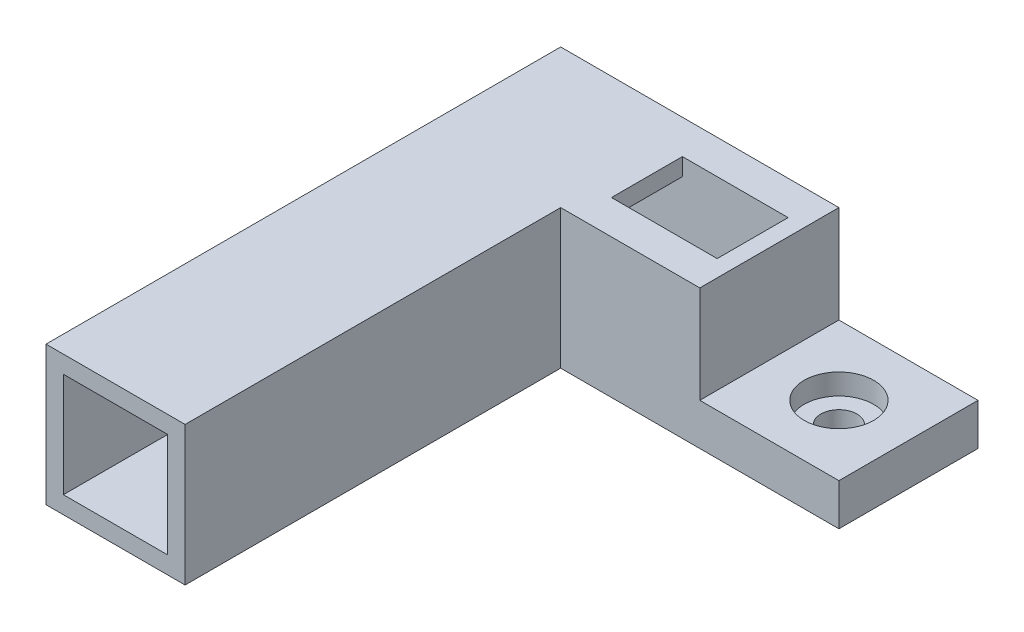
ISO-10303-21;
HEADER;
FILE_DESCRIPTION(('STEP AP214'),'2;1');
FILE_NAME('part.step','',(''),(''),'','','');
FILE_SCHEMA(('AUTOMOTIVE_DESIGN { 1 0 10303 214 1 1 1 1 }'));
ENDSEC;
DATA;
#1=APPLICATION_CONTEXT('core data for automotive mechanical design processes');
#2=APPLICATION_PROTOCOL_DEFINITION('international standard','automotive_design',2000,#1);
#3=PRODUCT_CONTEXT('',#1,'mechanical');
#4=PRODUCT('Part','Part','',(#3));
#5=PRODUCT_RELATED_PRODUCT_CATEGORY('part','',(#4));
#6=PRODUCT_DEFINITION_FORMATION('','',#4);
#7=PRODUCT_DEFINITION_CONTEXT('part definition',#1,'design');
#8=PRODUCT_DEFINITION('design','',#6,#7);
#9=PRODUCT_DEFINITION_SHAPE('','',#8);
#10=(LENGTH_UNIT() NAMED_UNIT(*) SI_UNIT(.MILLI.,.METRE.));
#11=(NAMED_UNIT(*) PLANE_ANGLE_UNIT() SI_UNIT($,.RADIAN.));
#12=(NAMED_UNIT(*) SI_UNIT($,.STERADIAN.) SOLID_ANGLE_UNIT());
#13=UNCERTAINTY_MEASURE_WITH_UNIT(LENGTH_MEASURE(1.E-05),#10,'distance_accuracy_value','');
#14=(GEOMETRIC_REPRESENTATION_CONTEXT(3) GLOBAL_UNCERTAINTY_ASSIGNED_CONTEXT((#13)) GLOBAL_UNIT_ASSIGNED_CONTEXT((#10,
#11,#12)) REPRESENTATION_CONTEXT('',''));
#15=CARTESIAN_POINT('',(0.,0.,0.));
#16=DIRECTION('',(0.,0.,1.));
#17=DIRECTION('',(1.,0.,0.));
#18=AXIS2_PLACEMENT_3D('',#15,#16,#17);
#19=CARTESIAN_POINT('',(0.,20.,0.));
#20=DIRECTION('',(0.,1.,0.));
#21=DIRECTION('',(0.,0.,1.));
#22=AXIS2_PLACEMENT_3D('',#19,#20,#21);
#23=PLANE('',#22);
#24=DIRECTION('',(0.,0.,1.));
#25=VECTOR('',#24,1.);
#26=CARTESIAN_POINT('',(10.,20.,0.));
#27=LINE('',#26,#25);
#28=CARTESIAN_POINT('',(10.,20.,-9.99999999999999));
#29=VERTEX_POINT('',#28);
#30=CARTESIAN_POINT('',(10.,20.,10.));
#31=VERTEX_POINT('',#30);
#32=EDGE_CURVE('E281',#29,#31,#27,.T.);
#33=ORIENTED_EDGE('',*,*,#32,.F.);
#34=DIRECTION('',(-1.,0.,0.));
#35=VECTOR('',#34,1.);
#36=CARTESIAN_POINT('',(0.,20.,-9.99999999999999));
#37=LINE('',#36,#35);
#38=CARTESIAN_POINT('',(-30.,20.,-9.99999999999999));
#39=VERTEX_POINT('',#38);
#40=EDGE_CURVE('E285',#29,#39,#37,.T.);
#41=ORIENTED_EDGE('',*,*,#40,.T.);
#42=DIRECTION('',(0.,0.,1.));
#43=VECTOR('',#42,1.);
#44=CARTESIAN_POINT('',(-30.,20.,-9.99999999999999));
#45=LINE('',#44,#43);
#46=CARTESIAN_POINT('',(-30.,20.,64.));
#47=VERTEX_POINT('',#46);
#48=EDGE_CURVE('E262',#39,#47,#45,.T.);
#49=ORIENTED_EDGE('',*,*,#48,.T.);
#50=DIRECTION('',(-1.,0.,0.));
#51=VECTOR('',#50,1.);
#52=CARTESIAN_POINT('',(-30.,20.,64.));
#53=LINE('',#52,#51);
#54=CARTESIAN_POINT('',(-9.99999999999999,20.,64.));
#55=VERTEX_POINT('',#54);
#56=EDGE_CURVE('E247',#55,#47,#53,.T.);
#57=ORIENTED_EDGE('',*,*,#56,.F.);
#58=DIRECTION('',(0.,0.,-1.));
#59=VECTOR('',#58,1.);
#60=CARTESIAN_POINT('',(-9.99999999999999,20.,64.));
#61=LINE('',#60,#59);
#62=CARTESIAN_POINT('',(-9.99999999999999,20.,10.));
#63=VERTEX_POINT('',#62);
#64=EDGE_CURVE('E251',#55,#63,#61,.T.);
#65=ORIENTED_EDGE('',*,*,#64,.T.);
#66=DIRECTION('',(1.,0.,0.));
#67=VECTOR('',#66,1.);
#68=CARTESIAN_POINT('',(0.,20.,10.));
#69=LINE('',#68,#67);
#70=EDGE_CURVE('E289',#63,#31,#69,.T.);
#71=ORIENTED_EDGE('',*,*,#70,.T.);
#72=EDGE_LOOP('',(#33,#41,#49,#57,#65,#71));
#73=FACE_BOUND('',#72,.T.);
#74=DIRECTION('',(1.,0.,0.));
#75=VECTOR('',#74,1.);
#76=CARTESIAN_POINT('',(0.,20.,-5.1));
#77=LINE('',#76,#75);
#78=CARTESIAN_POINT('',(-7.6,20.,-5.1));
#79=VERTEX_POINT('',#78);
#80=CARTESIAN_POINT('',(7.6,20.,-5.1));
#81=VERTEX_POINT('',#80);
#82=EDGE_CURVE('E411',#79,#81,#77,.T.);
#83=ORIENTED_EDGE('',*,*,#82,.T.);
#84=DIRECTION('',(0.,0.,1.));
#85=VECTOR('',#84,1.);
#86=CARTESIAN_POINT('',(7.6,20.,0.));
#87=LINE('',#86,#85);
#88=CARTESIAN_POINT('',(7.6,20.,5.1));
#89=VERTEX_POINT('',#88);
#90=EDGE_CURVE('E406',#81,#89,#87,.T.);
#91=ORIENTED_EDGE('',*,*,#90,.T.);
#92=DIRECTION('',(1.,0.,0.));
#93=VECTOR('',#92,1.);
#94=CARTESIAN_POINT('',(0.,20.,5.1));
#95=LINE('',#94,#93);
#96=CARTESIAN_POINT('',(-7.6,20.,5.1));
#97=VERTEX_POINT('',#96);
#98=EDGE_CURVE('E180',#97,#89,#95,.T.);
#99=ORIENTED_EDGE('',*,*,#98,.F.);
#100=DIRECTION('',(0.,0.,-1.));
#101=VECTOR('',#100,1.);
#102=CARTESIAN_POINT('',(-7.6,20.,0.));
#103=LINE('',#102,#101);
#104=EDGE_CURVE('E166',#97,#79,#103,.T.);
#105=ORIENTED_EDGE('',*,*,#104,.T.);
#106=EDGE_LOOP('',(#83,#91,#99,#105));
#107=FACE_BOUND('',#106,.T.);
#108=ADVANCED_FACE('F41',(#73,#107),#23,.T.);
#109=CARTESIAN_POINT('',(0.,17.5,0.));
#110=DIRECTION('',(0.,-1.,0.));
#111=DIRECTION('',(0.,0.,-1.));
#112=AXIS2_PLACEMENT_3D('',#109,#110,#111);
#113=PLANE('',#112);
#114=DIRECTION('',(-1.,0.,0.));
#115=VECTOR('',#114,1.);
#116=CARTESIAN_POINT('',(-27.5,17.5,-5.1));
#117=LINE('',#116,#115);
#118=CARTESIAN_POINT('',(-7.6,17.5,-5.1));
#119=VERTEX_POINT('',#118);
#120=CARTESIAN_POINT('',(-27.5,17.5,-5.1));
#121=VERTEX_POINT('',#120);
#122=EDGE_CURVE('E178',#119,#121,#117,.T.);
#123=ORIENTED_EDGE('',*,*,#122,.F.);
#124=DIRECTION('',(0.,0.,-1.));
#125=VECTOR('',#124,1.);
#126=CARTESIAN_POINT('',(-7.6,17.5,0.));
#127=LINE('',#126,#125);
#128=CARTESIAN_POINT('',(-7.6,17.5,5.1));
#129=VERTEX_POINT('',#128);
#130=EDGE_CURVE('E163',#129,#119,#127,.T.);
#131=ORIENTED_EDGE('',*,*,#130,.F.);
#132=DIRECTION('',(1.,0.,0.));
#133=VECTOR('',#132,1.);
#134=CARTESIAN_POINT('',(-27.5,17.5,5.1));
#135=LINE('',#134,#133);
#136=CARTESIAN_POINT('',(-12.5,17.5,5.1));
#137=VERTEX_POINT('',#136);
#138=EDGE_CURVE('E172',#137,#129,#135,.T.);
#139=ORIENTED_EDGE('',*,*,#138,.F.);
#140=DIRECTION('',(0.,0.,1.));
#141=VECTOR('',#140,1.);
#142=CARTESIAN_POINT('',(-12.5,17.5,0.));
#143=LINE('',#142,#141);
#144=CARTESIAN_POINT('',(-12.5,17.5,64.));
#145=VERTEX_POINT('',#144);
#146=EDGE_CURVE('E224',#137,#145,#143,.T.);
#147=ORIENTED_EDGE('',*,*,#146,.T.);
#148=DIRECTION('',(1.,0.,0.));
#149=VECTOR('',#148,1.);
#150=CARTESIAN_POINT('',(0.,17.5,64.));
#151=LINE('',#150,#149);
#152=CARTESIAN_POINT('',(-27.5,17.5,64.));
#153=VERTEX_POINT('',#152);
#154=EDGE_CURVE('E212',#153,#145,#151,.T.);
#155=ORIENTED_EDGE('',*,*,#154,.F.);
#156=DIRECTION('',(0.,0.,1.));
#157=VECTOR('',#156,1.);
#158=CARTESIAN_POINT('',(-27.5,17.5,0.));
#159=LINE('',#158,#157);
#160=EDGE_CURVE('E232',#121,#153,#159,.T.);
#161=ORIENTED_EDGE('',*,*,#160,.F.);
#162=EDGE_LOOP('',(#123,#131,#139,#147,#155,#161));
#163=FACE_BOUND('',#162,.T.);
#164=ADVANCED_FACE('F176',(#163),#113,.T.);
#165=CARTESIAN_POINT('',(7.6,0.,0.));
#166=DIRECTION('',(-1.,0.,0.));
#167=DIRECTION('',(0.,0.,1.));
#168=AXIS2_PLACEMENT_3D('',#165,#166,#167);
#169=PLANE('',#168);
#170=DIRECTION('',(0.,1.,0.));
#171=VECTOR('',#170,1.);
#172=CARTESIAN_POINT('',(7.6,0.,5.1));
#173=LINE('',#172,#171);
#174=CARTESIAN_POINT('',(7.6,0.,5.1));
#175=VERTEX_POINT('',#174);
#176=EDGE_CURVE('E275',#175,#89,#173,.T.);
#177=ORIENTED_EDGE('',*,*,#176,.T.);
#178=ORIENTED_EDGE('',*,*,#90,.F.);
#179=DIRECTION('',(0.,1.,0.));
#180=VECTOR('',#179,1.);
#181=CARTESIAN_POINT('',(7.6,0.,-5.1));
#182=LINE('',#181,#180);
#183=CARTESIAN_POINT('',(7.6,0.,-5.1));
#184=VERTEX_POINT('',#183);
#185=EDGE_CURVE('E58',#184,#81,#182,.T.);
#186=ORIENTED_EDGE('',*,*,#185,.F.);
#187=DIRECTION('',(0.,0.,1.));
#188=VECTOR('',#187,1.);
#189=CARTESIAN_POINT('',(7.6,0.,0.));
#190=LINE('',#189,#188);
#191=EDGE_CURVE('E265',#184,#175,#190,.T.);
#192=ORIENTED_EDGE('',*,*,#191,.T.);
#193=EDGE_LOOP('',(#177,#178,#186,#192));
#194=FACE_BOUND('',#193,.T.);
#195=ADVANCED_FACE('F403',(#194),#169,.T.);
#196=CARTESIAN_POINT('',(0.,0.,5.1));
#197=DIRECTION('',(0.,0.,1.));
#198=DIRECTION('',(1.,0.,0.));
#199=AXIS2_PLACEMENT_3D('',#196,#197,#198);
#200=PLANE('',#199);
#201=ORIENTED_EDGE('',*,*,#138,.T.);
#202=DIRECTION('',(0.,1.,0.));
#203=VECTOR('',#202,1.);
#204=CARTESIAN_POINT('',(-7.6,17.5,5.1));
#205=LINE('',#204,#203);
#206=EDGE_CURVE('E160',#129,#97,#205,.T.);
#207=ORIENTED_EDGE('',*,*,#206,.T.);
#208=ORIENTED_EDGE('',*,*,#98,.T.);
#209=ORIENTED_EDGE('',*,*,#176,.F.);
#210=DIRECTION('',(1.,0.,0.));
#211=VECTOR('',#210,1.);
#212=CARTESIAN_POINT('',(0.,0.,5.1));
#213=LINE('',#212,#211);
#214=CARTESIAN_POINT('',(-27.5,0.,5.1));
#215=VERTEX_POINT('',#214);
#216=EDGE_CURVE('E271',#215,#175,#213,.T.);
#217=ORIENTED_EDGE('',*,*,#216,.F.);
#218=DIRECTION('',(0.,1.,0.));
#219=VECTOR('',#218,1.);
#220=CARTESIAN_POINT('',(-27.5,-12.5,5.1));
#221=LINE('',#220,#219);
#222=CARTESIAN_POINT('',(-27.5,2.5,5.1));
#223=VERTEX_POINT('',#222);
#224=EDGE_CURVE('E195',#215,#223,#221,.T.);
#225=ORIENTED_EDGE('',*,*,#224,.T.);
#226=DIRECTION('',(1.,0.,0.));
#227=VECTOR('',#226,1.);
#228=CARTESIAN_POINT('',(-27.5,2.5,5.1));
#229=LINE('',#228,#227);
#230=CARTESIAN_POINT('',(-12.5,2.5,5.1));
#231=VERTEX_POINT('',#230);
#232=EDGE_CURVE('E189',#223,#231,#229,.T.);
#233=ORIENTED_EDGE('',*,*,#232,.T.);
#234=DIRECTION('',(0.,-1.,0.));
#235=VECTOR('',#234,1.);
#236=CARTESIAN_POINT('',(-12.5,0.,5.1));
#237=LINE('',#236,#235);
#238=EDGE_CURVE('E184',#137,#231,#237,.T.);
#239=ORIENTED_EDGE('',*,*,#238,.F.);
#240=EDGE_LOOP('',(#201,#207,#208,#209,#217,#225,#233,#239));
#241=FACE_BOUND('',#240,.T.);
#242=ADVANCED_FACE('F182',(#241),#200,.F.);
#243=CARTESIAN_POINT('',(0.,0.,-5.1));
#244=DIRECTION('',(0.,0.,1.));
#245=DIRECTION('',(1.,0.,0.));
#246=AXIS2_PLACEMENT_3D('',#243,#244,#245);
#247=PLANE('',#246);
#248=ORIENTED_EDGE('',*,*,#185,.T.);
#249=ORIENTED_EDGE('',*,*,#82,.F.);
#250=DIRECTION('',(0.,1.,0.));
#251=VECTOR('',#250,1.);
#252=CARTESIAN_POINT('',(-7.6,17.5,-5.1));
#253=LINE('',#252,#251);
#254=EDGE_CURVE('E64',#119,#79,#253,.T.);
#255=ORIENTED_EDGE('',*,*,#254,.F.);
#256=ORIENTED_EDGE('',*,*,#122,.T.);
#257=DIRECTION('',(0.,1.,0.));
#258=VECTOR('',#257,1.);
#259=CARTESIAN_POINT('',(-27.5,2.5,-5.1));
#260=LINE('',#259,#258);
#261=CARTESIAN_POINT('',(-27.5,0.,-5.1));
#262=VERTEX_POINT('',#261);
#263=EDGE_CURVE('E202',#262,#121,#260,.T.);
#264=ORIENTED_EDGE('',*,*,#263,.F.);
#265=DIRECTION('',(1.,0.,0.));
#266=VECTOR('',#265,1.);
#267=CARTESIAN_POINT('',(0.,0.,-5.1));
#268=LINE('',#267,#266);
#269=EDGE_CURVE('E268',#262,#184,#268,.T.);
#270=ORIENTED_EDGE('',*,*,#269,.T.);
#271=EDGE_LOOP('',(#248,#249,#255,#256,#264,#270));
#272=FACE_BOUND('',#271,.T.);
#273=ADVANCED_FACE('F399',(#272),#247,.T.);
#274=CARTESIAN_POINT('',(-27.5,0.,0.));
#275=DIRECTION('',(-1.,0.,0.));
#276=DIRECTION('',(0.,0.,1.));
#277=AXIS2_PLACEMENT_3D('',#274,#275,#276);
#278=PLANE('',#277);
#279=ORIENTED_EDGE('',*,*,#263,.T.);
#280=ORIENTED_EDGE('',*,*,#160,.T.);
#281=DIRECTION('',(0.,-1.,0.));
#282=VECTOR('',#281,1.);
#283=CARTESIAN_POINT('',(-27.5,0.,64.));
#284=LINE('',#283,#282);
#285=CARTESIAN_POINT('',(-27.5,2.5,64.));
#286=VERTEX_POINT('',#285);
#287=EDGE_CURVE('E216',#153,#286,#284,.T.);
#288=ORIENTED_EDGE('',*,*,#287,.T.);
#289=DIRECTION('',(0.,0.,1.));
#290=VECTOR('',#289,1.);
#291=CARTESIAN_POINT('',(-27.5,2.5,0.));
#292=LINE('',#291,#290);
#293=EDGE_CURVE('E229',#223,#286,#292,.T.);
#294=ORIENTED_EDGE('',*,*,#293,.F.);
#295=ORIENTED_EDGE('',*,*,#224,.F.);
#296=DIRECTION('',(0.,0.,-1.));
#297=VECTOR('',#296,1.);
#298=CARTESIAN_POINT('',(-27.5,0.,0.));
#299=LINE('',#298,#297);
#300=EDGE_CURVE('E198',#215,#262,#299,.T.);
#301=ORIENTED_EDGE('',*,*,#300,.T.);
#302=EDGE_LOOP('',(#279,#280,#288,#294,#295,#301));
#303=FACE_BOUND('',#302,.T.);
#304=ADVANCED_FACE('F396',(#303),#278,.F.);
#305=CARTESIAN_POINT('',(-12.5,0.,0.));
#306=DIRECTION('',(-1.,0.,0.));
#307=DIRECTION('',(0.,0.,1.));
#308=AXIS2_PLACEMENT_3D('',#305,#306,#307);
#309=PLANE('',#308);
#310=ORIENTED_EDGE('',*,*,#146,.F.);
#311=ORIENTED_EDGE('',*,*,#238,.T.);
#312=DIRECTION('',(0.,0.,1.));
#313=VECTOR('',#312,1.);
#314=CARTESIAN_POINT('',(-12.5,2.5,0.));
#315=LINE('',#314,#313);
#316=CARTESIAN_POINT('',(-12.5,2.5,64.));
#317=VERTEX_POINT('',#316);
#318=EDGE_CURVE('E225',#231,#317,#315,.T.);
#319=ORIENTED_EDGE('',*,*,#318,.T.);
#320=DIRECTION('',(0.,-1.,0.));
#321=VECTOR('',#320,1.);
#322=CARTESIAN_POINT('',(-12.5,0.,64.));
#323=LINE('',#322,#321);
#324=EDGE_CURVE('E208',#145,#317,#323,.T.);
#325=ORIENTED_EDGE('',*,*,#324,.F.);
#326=EDGE_LOOP('',(#310,#311,#319,#325));
#327=FACE_BOUND('',#326,.T.);
#328=ADVANCED_FACE('F382',(#327),#309,.T.);
#329=CARTESIAN_POINT('',(0.,0.,64.));
#330=DIRECTION('',(0.,0.,1.));
#331=DIRECTION('',(1.,0.,0.));
#332=AXIS2_PLACEMENT_3D('',#329,#330,#331);
#333=PLANE('',#332);
#334=DIRECTION('',(0.,-1.,0.));
#335=VECTOR('',#334,1.);
#336=CARTESIAN_POINT('',(-30.,20.,64.));
#337=LINE('',#336,#335);
#338=CARTESIAN_POINT('',(-30.,0.,64.));
#339=VERTEX_POINT('',#338);
#340=EDGE_CURVE('E237',#47,#339,#337,.T.);
#341=ORIENTED_EDGE('',*,*,#340,.T.);
#342=DIRECTION('',(1.,0.,0.));
#343=VECTOR('',#342,1.);
#344=CARTESIAN_POINT('',(-30.,0.,64.));
#345=LINE('',#344,#343);
#346=CARTESIAN_POINT('',(-9.99999999999999,0.,64.));
#347=VERTEX_POINT('',#346);
#348=EDGE_CURVE('E241',#339,#347,#345,.T.);
#349=ORIENTED_EDGE('',*,*,#348,.T.);
#350=DIRECTION('',(0.,1.,0.));
#351=VECTOR('',#350,1.);
#352=CARTESIAN_POINT('',(-9.99999999999999,20.,64.));
#353=LINE('',#352,#351);
#354=EDGE_CURVE('E244',#347,#55,#353,.T.);
#355=ORIENTED_EDGE('',*,*,#354,.T.);
#356=ORIENTED_EDGE('',*,*,#56,.T.);
#357=EDGE_LOOP('',(#341,#349,#355,#356));
#358=FACE_BOUND('',#357,.T.);
#359=ORIENTED_EDGE('',*,*,#154,.T.);
#360=ORIENTED_EDGE('',*,*,#324,.T.);
#361=DIRECTION('',(1.,0.,0.));
#362=VECTOR('',#361,1.);
#363=CARTESIAN_POINT('',(0.,2.5,64.));
#364=LINE('',#363,#362);
#365=EDGE_CURVE('E220',#286,#317,#364,.T.);
#366=ORIENTED_EDGE('',*,*,#365,.F.);
#367=ORIENTED_EDGE('',*,*,#287,.F.);
#368=EDGE_LOOP('',(#359,#360,#366,#367));
#369=FACE_BOUND('',#368,.T.);
#370=ADVANCED_FACE('F379',(#358,#369),#333,.T.);
#371=CARTESIAN_POINT('',(-30.,6.,10.));
#372=DIRECTION('',(0.,0.,-1.));
#373=DIRECTION('',(-1.,0.,0.));
#374=AXIS2_PLACEMENT_3D('',#371,#372,#373);
#375=PLANE('',#374);
#376=DIRECTION('',(0.,1.,0.));
#377=VECTOR('',#376,1.);
#378=CARTESIAN_POINT('',(-9.99999999999999,20.,10.));
#379=LINE('',#378,#377);
#380=CARTESIAN_POINT('',(-9.99999999999999,0.,10.));
#381=VERTEX_POINT('',#380);
#382=EDGE_CURVE('E228',#381,#63,#379,.T.);
#383=ORIENTED_EDGE('',*,*,#382,.F.);
#384=DIRECTION('',(1.,0.,0.));
#385=VECTOR('',#384,1.);
#386=CARTESIAN_POINT('',(-30.,0.,10.));
#387=LINE('',#386,#385);
#388=CARTESIAN_POINT('',(30.,0.,10.));
#389=VERTEX_POINT('',#388);
#390=EDGE_CURVE('E314',#381,#389,#387,.T.);
#391=ORIENTED_EDGE('',*,*,#390,.T.);
#392=DIRECTION('',(0.,-1.,0.));
#393=VECTOR('',#392,1.);
#394=CARTESIAN_POINT('',(30.,6.,10.));
#395=LINE('',#394,#393);
#396=CARTESIAN_POINT('',(30.,6.,10.));
#397=VERTEX_POINT('',#396);
#398=EDGE_CURVE('E11',#397,#389,#395,.T.);
#399=ORIENTED_EDGE('',*,*,#398,.F.);
#400=DIRECTION('',(1.,0.,0.));
#401=VECTOR('',#400,1.);
#402=CARTESIAN_POINT('',(-30.,6.,10.));
#403=LINE('',#402,#401);
#404=CARTESIAN_POINT('',(10.,6.,10.));
#405=VERTEX_POINT('',#404);
#406=EDGE_CURVE('E315',#405,#397,#403,.T.);
#407=ORIENTED_EDGE('',*,*,#406,.F.);
#408=DIRECTION('',(0.,-1.,0.));
#409=VECTOR('',#408,1.);
#410=CARTESIAN_POINT('',(10.,20.,10.));
#411=LINE('',#410,#409);
#412=EDGE_CURVE('E292',#31,#405,#411,.T.);
#413=ORIENTED_EDGE('',*,*,#412,.F.);
#414=ORIENTED_EDGE('',*,*,#70,.F.);
#415=EDGE_LOOP('',(#383,#391,#399,#407,#413,#414));
#416=FACE_BOUND('',#415,.T.);
#417=ADVANCED_FACE('F43',(#416),#375,.F.);
#418=CARTESIAN_POINT('',(0.,0.,0.));
#419=DIRECTION('',(0.,-1.,0.));
#420=DIRECTION('',(0.,0.,-1.));
#421=AXIS2_PLACEMENT_3D('',#418,#419,#420);
#422=PLANE('',#421);
#423=ORIENTED_EDGE('',*,*,#300,.F.);
#424=ORIENTED_EDGE('',*,*,#216,.T.);
#425=ORIENTED_EDGE('',*,*,#191,.F.);
#426=ORIENTED_EDGE('',*,*,#269,.F.);
#427=EDGE_LOOP('',(#423,#424,#425,#426));
#428=FACE_BOUND('',#427,.T.);
#429=CARTESIAN_POINT('',(20.,0.,0.));
#430=DIRECTION('',(0.,1.,0.));
#431=DIRECTION('',(0.,0.,1.));
#432=AXIS2_PLACEMENT_3D('',#429,#430,#431);
#433=CIRCLE('',#432,2.6);
#434=CARTESIAN_POINT('',(20.,0.,2.6));
#435=VERTEX_POINT('',#434);
#436=EDGE_CURVE('E310',#435,#435,#433,.T.);
#437=ORIENTED_EDGE('',*,*,#436,.T.);
#438=EDGE_LOOP('',(#437));
#439=FACE_BOUND('',#438,.T.);
#440=ORIENTED_EDGE('',*,*,#390,.F.);
#441=DIRECTION('',(0.,0.,-1.));
#442=VECTOR('',#441,1.);
#443=CARTESIAN_POINT('',(-9.99999999999999,0.,64.));
#444=LINE('',#443,#442);
#445=EDGE_CURVE('E258',#347,#381,#444,.T.);
#446=ORIENTED_EDGE('',*,*,#445,.F.);
#447=ORIENTED_EDGE('',*,*,#348,.F.);
#448=DIRECTION('',(0.,0.,1.));
#449=VECTOR('',#448,1.);
#450=CARTESIAN_POINT('',(-30.,0.,-9.99999999999999));
#451=LINE('',#450,#449);
#452=CARTESIAN_POINT('',(-30.,0.,-9.99999999999999));
#453=VERTEX_POINT('',#452);
#454=EDGE_CURVE('E319',#453,#339,#451,.T.);
#455=ORIENTED_EDGE('',*,*,#454,.F.);
#456=DIRECTION('',(1.,0.,0.));
#457=VECTOR('',#456,1.);
#458=CARTESIAN_POINT('',(-30.,0.,-9.99999999999999));
#459=LINE('',#458,#457);
#460=CARTESIAN_POINT('',(30.,0.,-9.99999999999999));
#461=VERTEX_POINT('',#460);
#462=EDGE_CURVE('E333',#453,#461,#459,.T.);
#463=ORIENTED_EDGE('',*,*,#462,.T.);
#464=DIRECTION('',(0.,0.,1.));
#465=VECTOR('',#464,1.);
#466=CARTESIAN_POINT('',(30.,0.,-9.99999999999999));
#467=LINE('',#466,#465);
#468=EDGE_CURVE('E329',#461,#389,#467,.T.);
#469=ORIENTED_EDGE('',*,*,#468,.T.);
#470=EDGE_LOOP('',(#440,#446,#447,#455,#463,#469));
#471=FACE_BOUND('',#470,.T.);
#472=ADVANCED_FACE('F354',(#428,#439,#471),#422,.T.);
#473=CARTESIAN_POINT('',(20.,0.,0.));
#474=DIRECTION('',(0.,1.,0.));
#475=DIRECTION('',(0.,0.,1.));
#476=AXIS2_PLACEMENT_3D('',#473,#474,#475);
#477=CYLINDRICAL_SURFACE('',#476,2.6);
#478=ORIENTED_EDGE('',*,*,#436,.F.);
#479=EDGE_LOOP('',(#478));
#480=FACE_BOUND('',#479,.T.);
#481=CARTESIAN_POINT('',(20.,3.,0.));
#482=DIRECTION('',(0.,1.,0.));
#483=DIRECTION('',(0.,0.,1.));
#484=AXIS2_PLACEMENT_3D('',#481,#482,#483);
#485=CIRCLE('',#484,2.6);
#486=CARTESIAN_POINT('',(20.,3.,2.6));
#487=VERTEX_POINT('',#486);
#488=EDGE_CURVE('E45',#487,#487,#485,.F.);
#489=ORIENTED_EDGE('',*,*,#488,.F.);
#490=EDGE_LOOP('',(#489));
#491=FACE_BOUND('',#490,.T.);
#492=ADVANCED_FACE('F438',(#480,#491),#477,.F.);
#493=CARTESIAN_POINT('',(30.,6.,-9.99999999999999));
#494=DIRECTION('',(1.,0.,0.));
#495=DIRECTION('',(0.,0.,-1.));
#496=AXIS2_PLACEMENT_3D('',#493,#494,#495);
#497=PLANE('',#496);
#498=ORIENTED_EDGE('',*,*,#468,.F.);
#499=DIRECTION('',(0.,-1.,0.));
#500=VECTOR('',#499,1.);
#501=CARTESIAN_POINT('',(30.,6.,-9.99999999999999));
#502=LINE('',#501,#500);
#503=CARTESIAN_POINT('',(30.,6.,-9.99999999999999));
#504=VERTEX_POINT('',#503);
#505=EDGE_CURVE('E51',#504,#461,#502,.T.);
#506=ORIENTED_EDGE('',*,*,#505,.F.);
#507=DIRECTION('',(0.,0.,1.));
#508=VECTOR('',#507,1.);
#509=CARTESIAN_POINT('',(30.,6.,-9.99999999999999));
#510=LINE('',#509,#508);
#511=EDGE_CURVE('E318',#504,#397,#510,.T.);
#512=ORIENTED_EDGE('',*,*,#511,.T.);
#513=ORIENTED_EDGE('',*,*,#398,.T.);
#514=EDGE_LOOP('',(#498,#506,#512,#513));
#515=FACE_BOUND('',#514,.T.);
#516=ADVANCED_FACE('F349',(#515),#497,.T.);
#517=CARTESIAN_POINT('',(-30.,6.,-9.99999999999999));
#518=DIRECTION('',(0.,0.,-1.));
#519=DIRECTION('',(-1.,0.,0.));
#520=AXIS2_PLACEMENT_3D('',#517,#518,#519);
#521=PLANE('',#520);
#522=ORIENTED_EDGE('',*,*,#462,.F.);
#523=DIRECTION('',(0.,-1.,0.));
#524=VECTOR('',#523,1.);
#525=CARTESIAN_POINT('',(-30.,6.,-9.99999999999999));
#526=LINE('',#525,#524);
#527=EDGE_CURVE('E326',#39,#453,#526,.T.);
#528=ORIENTED_EDGE('',*,*,#527,.F.);
#529=ORIENTED_EDGE('',*,*,#40,.F.);
#530=DIRECTION('',(0.,-1.,0.));
#531=VECTOR('',#530,1.);
#532=CARTESIAN_POINT('',(10.,20.,-9.99999999999999));
#533=LINE('',#532,#531);
#534=CARTESIAN_POINT('',(10.,6.,-9.99999999999999));
#535=VERTEX_POINT('',#534);
#536=EDGE_CURVE('E298',#29,#535,#533,.T.);
#537=ORIENTED_EDGE('',*,*,#536,.T.);
#538=DIRECTION('',(1.,0.,0.));
#539=VECTOR('',#538,1.);
#540=CARTESIAN_POINT('',(-30.,6.,-9.99999999999999));
#541=LINE('',#540,#539);
#542=EDGE_CURVE('E323',#535,#504,#541,.T.);
#543=ORIENTED_EDGE('',*,*,#542,.T.);
#544=ORIENTED_EDGE('',*,*,#505,.T.);
#545=EDGE_LOOP('',(#522,#528,#529,#537,#543,#544));
#546=FACE_BOUND('',#545,.T.);
#547=ADVANCED_FACE('F346',(#546),#521,.T.);
#548=CARTESIAN_POINT('',(-30.,6.,-9.99999999999999));
#549=DIRECTION('',(1.,0.,0.));
#550=DIRECTION('',(0.,0.,-1.));
#551=AXIS2_PLACEMENT_3D('',#548,#549,#550);
#552=PLANE('',#551);
#553=ORIENTED_EDGE('',*,*,#454,.T.);
#554=ORIENTED_EDGE('',*,*,#340,.F.);
#555=ORIENTED_EDGE('',*,*,#48,.F.);
#556=ORIENTED_EDGE('',*,*,#527,.T.);
#557=EDGE_LOOP('',(#553,#554,#555,#556));
#558=FACE_BOUND('',#557,.T.);
#559=ADVANCED_FACE('F359',(#558),#552,.F.);
#560=CARTESIAN_POINT('',(0.,6.,0.));
#561=DIRECTION('',(0.,-1.,0.));
#562=DIRECTION('',(0.,0.,-1.));
#563=AXIS2_PLACEMENT_3D('',#560,#561,#562);
#564=PLANE('',#563);
#565=CARTESIAN_POINT('',(20.,6.,0.));
#566=DIRECTION('',(0.,1.,0.));
#567=DIRECTION('',(0.,0.,1.));
#568=AXIS2_PLACEMENT_3D('',#565,#566,#567);
#569=CIRCLE('',#568,5.);
#570=CARTESIAN_POINT('',(20.,6.,5.));
#571=VERTEX_POINT('',#570);
#572=EDGE_CURVE('E302',#571,#571,#569,.T.);
#573=ORIENTED_EDGE('',*,*,#572,.F.);
#574=EDGE_LOOP('',(#573));
#575=FACE_BOUND('',#574,.T.);
#576=ORIENTED_EDGE('',*,*,#542,.F.);
#577=DIRECTION('',(0.,0.,1.));
#578=VECTOR('',#577,1.);
#579=CARTESIAN_POINT('',(10.,6.,0.));
#580=LINE('',#579,#578);
#581=EDGE_CURVE('E278',#535,#405,#580,.T.);
#582=ORIENTED_EDGE('',*,*,#581,.T.);
#583=ORIENTED_EDGE('',*,*,#406,.T.);
#584=ORIENTED_EDGE('',*,*,#511,.F.);
#585=EDGE_LOOP('',(#576,#582,#583,#584));
#586=FACE_BOUND('',#585,.T.);
#587=ADVANCED_FACE('F372',(#575,#586),#564,.F.);
#588=CARTESIAN_POINT('',(20.,3.,0.));
#589=DIRECTION('',(0.,1.,0.));
#590=DIRECTION('',(0.,0.,1.));
#591=AXIS2_PLACEMENT_3D('',#588,#589,#590);
#592=PLANE('',#591);
#593=CARTESIAN_POINT('',(20.,3.,0.));
#594=DIRECTION('',(0.,1.,0.));
#595=DIRECTION('',(0.,0.,1.));
#596=AXIS2_PLACEMENT_3D('',#593,#594,#595);
#597=CIRCLE('',#596,5.);
#598=CARTESIAN_POINT('',(20.,3.,5.));
#599=VERTEX_POINT('',#598);
#600=EDGE_CURVE('E303',#599,#599,#597,.T.);
#601=ORIENTED_EDGE('',*,*,#600,.T.);
#602=EDGE_LOOP('',(#601));
#603=FACE_BOUND('',#602,.T.);
#604=ORIENTED_EDGE('',*,*,#488,.T.);
#605=EDGE_LOOP('',(#604));
#606=FACE_BOUND('',#605,.T.);
#607=ADVANCED_FACE('F431',(#603,#606),#592,.T.);
#608=CARTESIAN_POINT('',(20.,3.,0.));
#609=DIRECTION('',(0.,1.,0.));
#610=DIRECTION('',(0.,0.,1.));
#611=AXIS2_PLACEMENT_3D('',#608,#609,#610);
#612=CYLINDRICAL_SURFACE('',#611,5.);
#613=ORIENTED_EDGE('',*,*,#600,.F.);
#614=EDGE_LOOP('',(#613));
#615=FACE_BOUND('',#614,.T.);
#616=ORIENTED_EDGE('',*,*,#572,.T.);
#617=EDGE_LOOP('',(#616));
#618=FACE_BOUND('',#617,.T.);
#619=ADVANCED_FACE('F430',(#615,#618),#612,.F.);
#620=CARTESIAN_POINT('',(10.,20.,0.));
#621=DIRECTION('',(1.,0.,0.));
#622=DIRECTION('',(0.,0.,-1.));
#623=AXIS2_PLACEMENT_3D('',#620,#621,#622);
#624=PLANE('',#623);
#625=ORIENTED_EDGE('',*,*,#581,.F.);
#626=ORIENTED_EDGE('',*,*,#536,.F.);
#627=ORIENTED_EDGE('',*,*,#32,.T.);
#628=ORIENTED_EDGE('',*,*,#412,.T.);
#629=EDGE_LOOP('',(#625,#626,#627,#628));
#630=FACE_BOUND('',#629,.T.);
#631=ADVANCED_FACE('F369',(#630),#624,.T.);
#632=CARTESIAN_POINT('',(-9.99999999999999,20.,64.));
#633=DIRECTION('',(-1.,0.,0.));
#634=DIRECTION('',(0.,0.,1.));
#635=AXIS2_PLACEMENT_3D('',#632,#633,#634);
#636=PLANE('',#635);
#637=ORIENTED_EDGE('',*,*,#382,.T.);
#638=ORIENTED_EDGE('',*,*,#64,.F.);
#639=ORIENTED_EDGE('',*,*,#354,.F.);
#640=ORIENTED_EDGE('',*,*,#445,.T.);
#641=EDGE_LOOP('',(#637,#638,#639,#640));
#642=FACE_BOUND('',#641,.T.);
#643=ADVANCED_FACE('F376',(#642),#636,.F.);
#644=CARTESIAN_POINT('',(0.,2.5,0.));
#645=DIRECTION('',(0.,-1.,0.));
#646=DIRECTION('',(0.,0.,-1.));
#647=AXIS2_PLACEMENT_3D('',#644,#645,#646);
#648=PLANE('',#647);
#649=ORIENTED_EDGE('',*,*,#318,.F.);
#650=ORIENTED_EDGE('',*,*,#232,.F.);
#651=ORIENTED_EDGE('',*,*,#293,.T.);
#652=ORIENTED_EDGE('',*,*,#365,.T.);
#653=EDGE_LOOP('',(#649,#650,#651,#652));
#654=FACE_BOUND('',#653,.T.);
#655=ADVANCED_FACE('F392',(#654),#648,.F.);
#656=CARTESIAN_POINT('',(-7.6,17.5,0.));
#657=DIRECTION('',(1.,0.,0.));
#658=DIRECTION('',(0.,0.,-1.));
#659=AXIS2_PLACEMENT_3D('',#656,#657,#658);
#660=PLANE('',#659);
#661=ORIENTED_EDGE('',*,*,#104,.F.);
#662=ORIENTED_EDGE('',*,*,#206,.F.);
#663=ORIENTED_EDGE('',*,*,#130,.T.);
#664=ORIENTED_EDGE('',*,*,#254,.T.);
#665=EDGE_LOOP('',(#661,#662,#663,#664));
#666=FACE_BOUND('',#665,.T.);
#667=ADVANCED_FACE('F162',(#666),#660,.T.);
#668=CLOSED_SHELL('',(#108,#164,#195,#242,#273,#304,#328,#370,#417,#472,#492,#516,#547,#559,
#587,#607,#619,#631,#643,#655,#667));
#669=MANIFOLD_SOLID_BREP('B2',#668);
#670=ADVANCED_BREP_SHAPE_REPRESENTATION('',(#18,#669),#14);
#671=SHAPE_DEFINITION_REPRESENTATION(#9,#670);
ENDSEC;
END-ISO-10303-21;
